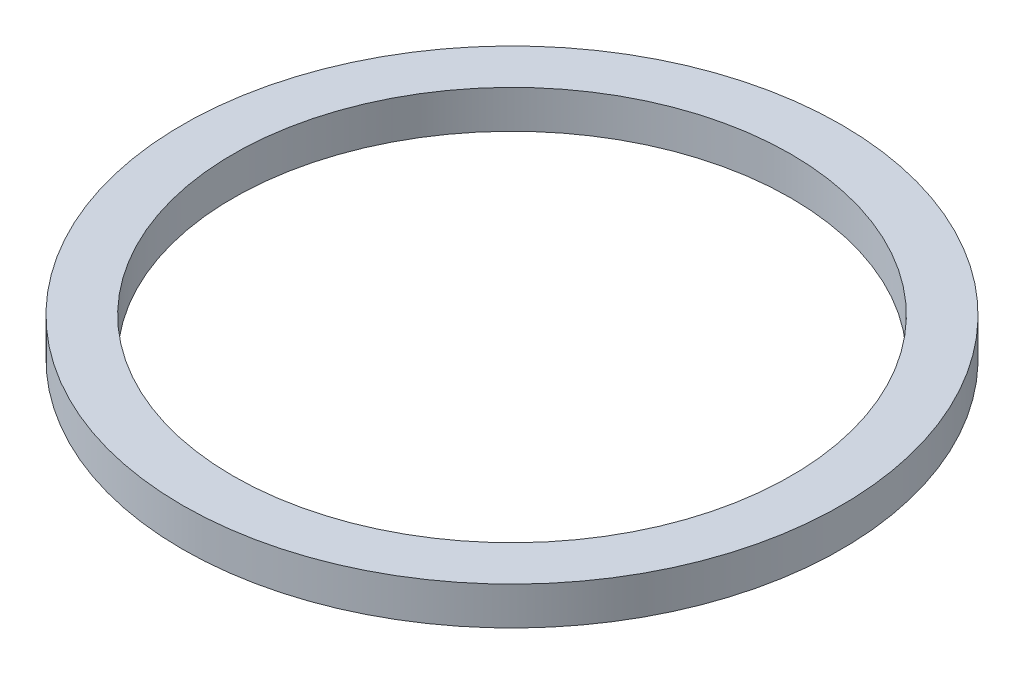
ISO-10303-21;
HEADER;
FILE_DESCRIPTION(('STEP AP214'),'2;1');
FILE_NAME('part.step','',(''),(''),'','','');
FILE_SCHEMA(('AUTOMOTIVE_DESIGN { 1 0 10303 214 1 1 1 1 }'));
ENDSEC;
DATA;
#1=APPLICATION_CONTEXT('core data for automotive mechanical design processes');
#2=APPLICATION_PROTOCOL_DEFINITION('international standard','automotive_design',2000,#1);
#3=PRODUCT_CONTEXT('',#1,'mechanical');
#4=PRODUCT('Part','Part','',(#3));
#5=PRODUCT_RELATED_PRODUCT_CATEGORY('part','',(#4));
#6=PRODUCT_DEFINITION_FORMATION('','',#4);
#7=PRODUCT_DEFINITION_CONTEXT('part definition',#1,'design');
#8=PRODUCT_DEFINITION('design','',#6,#7);
#9=PRODUCT_DEFINITION_SHAPE('','',#8);
#10=(LENGTH_UNIT() NAMED_UNIT(*) SI_UNIT(.MILLI.,.METRE.));
#11=(NAMED_UNIT(*) PLANE_ANGLE_UNIT() SI_UNIT($,.RADIAN.));
#12=(NAMED_UNIT(*) SI_UNIT($,.STERADIAN.) SOLID_ANGLE_UNIT());
#13=UNCERTAINTY_MEASURE_WITH_UNIT(LENGTH_MEASURE(1.E-05),#10,'distance_accuracy_value','');
#14=(GEOMETRIC_REPRESENTATION_CONTEXT(3) GLOBAL_UNCERTAINTY_ASSIGNED_CONTEXT((#13)) GLOBAL_UNIT_ASSIGNED_CONTEXT((#10,
#11,#12)) REPRESENTATION_CONTEXT('',''));
#15=CARTESIAN_POINT('',(0.,0.,0.));
#16=DIRECTION('',(0.,0.,1.));
#17=DIRECTION('',(1.,0.,0.));
#18=AXIS2_PLACEMENT_3D('',#15,#16,#17);
#19=CARTESIAN_POINT('',(0.,1.5,0.));
#20=DIRECTION('',(0.,1.,0.));
#21=DIRECTION('',(0.,0.,1.));
#22=AXIS2_PLACEMENT_3D('',#19,#20,#21);
#23=PLANE('',#22);
#24=CARTESIAN_POINT('',(0.,1.5,0.));
#25=DIRECTION('',(0.,1.,0.));
#26=DIRECTION('',(0.,0.,1.));
#27=AXIS2_PLACEMENT_3D('',#24,#25,#26);
#28=CIRCLE('',#27,13.);
#29=CARTESIAN_POINT('',(0.,1.5,13.));
#30=VERTEX_POINT('',#29);
#31=EDGE_CURVE('E10',#30,#30,#28,.T.);
#32=ORIENTED_EDGE('',*,*,#31,.T.);
#33=EDGE_LOOP('',(#32));
#34=FACE_BOUND('',#33,.T.);
#35=CARTESIAN_POINT('',(0.,1.5,0.));
#36=DIRECTION('',(0.,1.,0.));
#37=DIRECTION('',(0.,0.,1.));
#38=AXIS2_PLACEMENT_3D('',#35,#36,#37);
#39=CIRCLE('',#38,11.);
#40=CARTESIAN_POINT('',(0.,1.5,11.));
#41=VERTEX_POINT('',#40);
#42=EDGE_CURVE('E42',#41,#41,#39,.T.);
#43=ORIENTED_EDGE('',*,*,#42,.F.);
#44=EDGE_LOOP('',(#43));
#45=FACE_BOUND('',#44,.T.);
#46=ADVANCED_FACE('F31',(#34,#45),#23,.T.);
#47=CARTESIAN_POINT('',(0.,0.,0.));
#48=DIRECTION('',(0.,1.,0.));
#49=DIRECTION('',(0.,0.,1.));
#50=AXIS2_PLACEMENT_3D('',#47,#48,#49);
#51=PLANE('',#50);
#52=CARTESIAN_POINT('',(0.,0.,0.));
#53=DIRECTION('',(0.,1.,0.));
#54=DIRECTION('',(0.,0.,1.));
#55=AXIS2_PLACEMENT_3D('',#52,#53,#54);
#56=CIRCLE('',#55,13.);
#57=CARTESIAN_POINT('',(0.,0.,13.));
#58=VERTEX_POINT('',#57);
#59=EDGE_CURVE('E35',#58,#58,#56,.T.);
#60=ORIENTED_EDGE('',*,*,#59,.F.);
#61=EDGE_LOOP('',(#60));
#62=FACE_BOUND('',#61,.T.);
#63=CARTESIAN_POINT('',(0.,0.,0.));
#64=DIRECTION('',(0.,1.,0.));
#65=DIRECTION('',(0.,0.,1.));
#66=AXIS2_PLACEMENT_3D('',#63,#64,#65);
#67=CIRCLE('',#66,11.);
#68=CARTESIAN_POINT('',(0.,0.,11.));
#69=VERTEX_POINT('',#68);
#70=EDGE_CURVE('E44',#69,#69,#67,.T.);
#71=ORIENTED_EDGE('',*,*,#70,.T.);
#72=EDGE_LOOP('',(#71));
#73=FACE_BOUND('',#72,.T.);
#74=ADVANCED_FACE('F54',(#62,#73),#51,.F.);
#75=CARTESIAN_POINT('',(0.,1.5,0.));
#76=DIRECTION('',(0.,-1.,0.));
#77=DIRECTION('',(0.,0.,-1.));
#78=AXIS2_PLACEMENT_3D('',#75,#76,#77);
#79=CYLINDRICAL_SURFACE('',#78,13.);
#80=ORIENTED_EDGE('',*,*,#31,.F.);
#81=EDGE_LOOP('',(#80));
#82=FACE_BOUND('',#81,.T.);
#83=ORIENTED_EDGE('',*,*,#59,.T.);
#84=EDGE_LOOP('',(#83));
#85=FACE_BOUND('',#84,.T.);
#86=ADVANCED_FACE('F33',(#82,#85),#79,.T.);
#87=CARTESIAN_POINT('',(0.,1.5,0.));
#88=DIRECTION('',(0.,-1.,0.));
#89=DIRECTION('',(0.,0.,-1.));
#90=AXIS2_PLACEMENT_3D('',#87,#88,#89);
#91=CYLINDRICAL_SURFACE('',#90,11.);
#92=ORIENTED_EDGE('',*,*,#42,.T.);
#93=EDGE_LOOP('',(#92));
#94=FACE_BOUND('',#93,.T.);
#95=ORIENTED_EDGE('',*,*,#70,.F.);
#96=EDGE_LOOP('',(#95));
#97=FACE_BOUND('',#96,.T.);
#98=ADVANCED_FACE('F50',(#94,#97),#91,.F.);
#99=CLOSED_SHELL('',(#46,#74,#86,#98));
#100=MANIFOLD_SOLID_BREP('B2',#99);
#101=ADVANCED_BREP_SHAPE_REPRESENTATION('',(#18,#100),#14);
#102=SHAPE_DEFINITION_REPRESENTATION(#9,#101);
ENDSEC;
END-ISO-10303-21;
